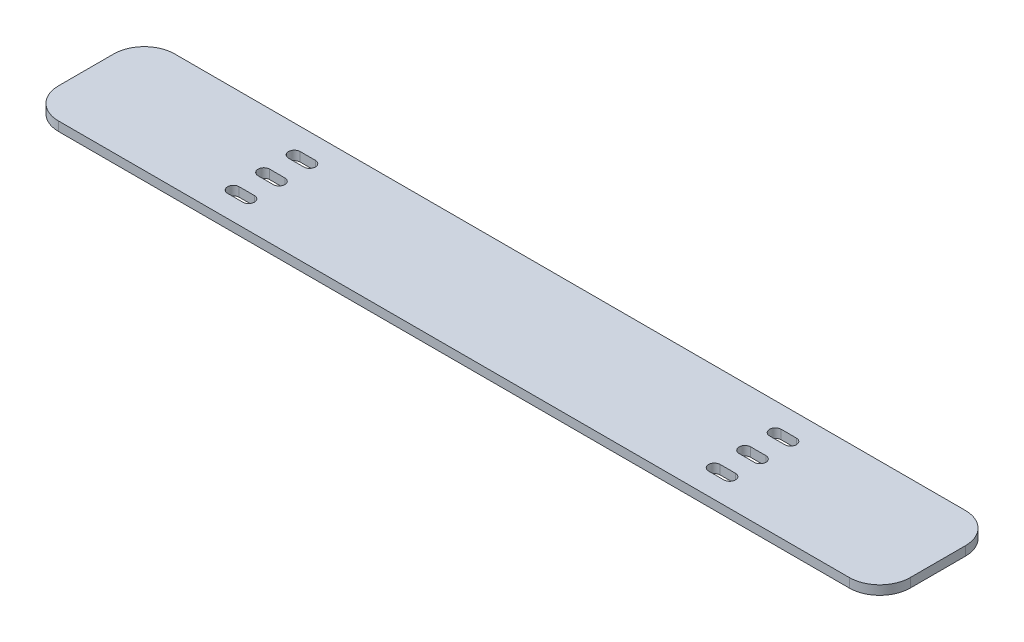
ISO-10303-21;
HEADER;
FILE_DESCRIPTION(('STEP AP214'),'2;1');
FILE_NAME('part.step','',(''),(''),'','','');
FILE_SCHEMA(('AUTOMOTIVE_DESIGN { 1 0 10303 214 1 1 1 1 }'));
ENDSEC;
DATA;
#1=APPLICATION_CONTEXT('core data for automotive mechanical design processes');
#2=APPLICATION_PROTOCOL_DEFINITION('international standard','automotive_design',2000,#1);
#3=PRODUCT_CONTEXT('',#1,'mechanical');
#4=PRODUCT('Part','Part','',(#3));
#5=PRODUCT_RELATED_PRODUCT_CATEGORY('part','',(#4));
#6=PRODUCT_DEFINITION_FORMATION('','',#4);
#7=PRODUCT_DEFINITION_CONTEXT('part definition',#1,'design');
#8=PRODUCT_DEFINITION('design','',#6,#7);
#9=PRODUCT_DEFINITION_SHAPE('','',#8);
#10=(LENGTH_UNIT() NAMED_UNIT(*) SI_UNIT(.MILLI.,.METRE.));
#11=(NAMED_UNIT(*) PLANE_ANGLE_UNIT() SI_UNIT($,.RADIAN.));
#12=(NAMED_UNIT(*) SI_UNIT($,.STERADIAN.) SOLID_ANGLE_UNIT());
#13=UNCERTAINTY_MEASURE_WITH_UNIT(LENGTH_MEASURE(1.E-05),#10,'distance_accuracy_value','');
#14=(GEOMETRIC_REPRESENTATION_CONTEXT(3) GLOBAL_UNCERTAINTY_ASSIGNED_CONTEXT((#13)) GLOBAL_UNIT_ASSIGNED_CONTEXT((#10,
#11,#12)) REPRESENTATION_CONTEXT('',''));
#15=CARTESIAN_POINT('',(0.,0.,0.));
#16=DIRECTION('',(0.,0.,1.));
#17=DIRECTION('',(1.,0.,0.));
#18=AXIS2_PLACEMENT_3D('',#15,#16,#17);
#19=CARTESIAN_POINT('',(10.,3.,28.1));
#20=DIRECTION('',(0.,-1.,0.));
#21=DIRECTION('',(0.,0.,-1.));
#22=AXIS2_PLACEMENT_3D('',#19,#20,#21);
#23=CYLINDRICAL_SURFACE('',#22,10.);
#24=CARTESIAN_POINT('',(10.,0.,28.1));
#25=DIRECTION('',(0.,1.,0.));
#26=DIRECTION('',(0.,0.,1.));
#27=AXIS2_PLACEMENT_3D('',#24,#25,#26);
#28=CIRCLE('',#27,10.);
#29=CARTESIAN_POINT('',(0.,0.,28.0999999999999));
#30=VERTEX_POINT('',#29);
#31=CARTESIAN_POINT('',(10.0000000000001,0.,38.1));
#32=VERTEX_POINT('',#31);
#33=EDGE_CURVE('E513',#30,#32,#28,.T.);
#34=ORIENTED_EDGE('',*,*,#33,.T.);
#35=DIRECTION('',(0.,-1.,0.));
#36=VECTOR('',#35,1.);
#37=CARTESIAN_POINT('',(10.0000000000001,3.,38.1));
#38=LINE('',#37,#36);
#39=CARTESIAN_POINT('',(10.0000000000001,3.,38.1));
#40=VERTEX_POINT('',#39);
#41=EDGE_CURVE('E11',#40,#32,#38,.T.);
#42=ORIENTED_EDGE('',*,*,#41,.F.);
#43=CARTESIAN_POINT('',(10.,3.,28.1));
#44=DIRECTION('',(0.,1.,0.));
#45=DIRECTION('',(0.,0.,1.));
#46=AXIS2_PLACEMENT_3D('',#43,#44,#45);
#47=CIRCLE('',#46,10.);
#48=CARTESIAN_POINT('',(0.,3.,28.0999999999999));
#49=VERTEX_POINT('',#48);
#50=EDGE_CURVE('E514',#49,#40,#47,.T.);
#51=ORIENTED_EDGE('',*,*,#50,.F.);
#52=DIRECTION('',(0.,-1.,0.));
#53=VECTOR('',#52,1.);
#54=CARTESIAN_POINT('',(0.,3.,28.0999999999999));
#55=LINE('',#54,#53);
#56=EDGE_CURVE('E540',#49,#30,#55,.T.);
#57=ORIENTED_EDGE('',*,*,#56,.T.);
#58=EDGE_LOOP('',(#34,#42,#51,#57));
#59=FACE_BOUND('',#58,.T.);
#60=ADVANCED_FACE('F39',(#59),#23,.T.);
#61=CARTESIAN_POINT('',(10.0000000000001,3.,38.1));
#62=DIRECTION('',(0.,0.,-1.));
#63=DIRECTION('',(-1.,0.,0.));
#64=AXIS2_PLACEMENT_3D('',#61,#62,#63);
#65=PLANE('',#64);
#66=DIRECTION('',(1.,0.,0.));
#67=VECTOR('',#66,1.);
#68=CARTESIAN_POINT('',(10.0000000000001,0.,38.1));
#69=LINE('',#68,#67);
#70=CARTESIAN_POINT('',(269.4,0.,38.1));
#71=VERTEX_POINT('',#70);
#72=EDGE_CURVE('E544',#32,#71,#69,.T.);
#73=ORIENTED_EDGE('',*,*,#72,.T.);
#74=DIRECTION('',(0.,-1.,0.));
#75=VECTOR('',#74,1.);
#76=CARTESIAN_POINT('',(269.4,3.,38.1));
#77=LINE('',#76,#75);
#78=CARTESIAN_POINT('',(269.4,3.,38.1));
#79=VERTEX_POINT('',#78);
#80=EDGE_CURVE('E47',#79,#71,#77,.T.);
#81=ORIENTED_EDGE('',*,*,#80,.F.);
#82=DIRECTION('',(1.,0.,0.));
#83=VECTOR('',#82,1.);
#84=CARTESIAN_POINT('',(10.0000000000001,3.,38.1));
#85=LINE('',#84,#83);
#86=EDGE_CURVE('E518',#40,#79,#85,.T.);
#87=ORIENTED_EDGE('',*,*,#86,.F.);
#88=ORIENTED_EDGE('',*,*,#41,.T.);
#89=EDGE_LOOP('',(#73,#81,#87,#88));
#90=FACE_BOUND('',#89,.T.);
#91=ADVANCED_FACE('F614',(#90),#65,.F.);
#92=CARTESIAN_POINT('',(269.4,3.,28.1));
#93=DIRECTION('',(0.,-1.,0.));
#94=DIRECTION('',(0.,0.,-1.));
#95=AXIS2_PLACEMENT_3D('',#92,#93,#94);
#96=CYLINDRICAL_SURFACE('',#95,10.);
#97=CARTESIAN_POINT('',(269.4,0.,28.1));
#98=DIRECTION('',(0.,1.,0.));
#99=DIRECTION('',(0.,0.,1.));
#100=AXIS2_PLACEMENT_3D('',#97,#98,#99);
#101=CIRCLE('',#100,10.);
#102=CARTESIAN_POINT('',(279.4,0.,28.0999999999999));
#103=VERTEX_POINT('',#102);
#104=EDGE_CURVE('E547',#71,#103,#101,.T.);
#105=ORIENTED_EDGE('',*,*,#104,.T.);
#106=DIRECTION('',(0.,-1.,0.));
#107=VECTOR('',#106,1.);
#108=CARTESIAN_POINT('',(279.4,3.,28.0999999999999));
#109=LINE('',#108,#107);
#110=CARTESIAN_POINT('',(279.4,3.,28.0999999999999));
#111=VERTEX_POINT('',#110);
#112=EDGE_CURVE('E583',#111,#103,#109,.T.);
#113=ORIENTED_EDGE('',*,*,#112,.F.);
#114=CARTESIAN_POINT('',(269.4,3.,28.1));
#115=DIRECTION('',(0.,1.,0.));
#116=DIRECTION('',(0.,0.,1.));
#117=AXIS2_PLACEMENT_3D('',#114,#115,#116);
#118=CIRCLE('',#117,10.);
#119=EDGE_CURVE('E522',#79,#111,#118,.T.);
#120=ORIENTED_EDGE('',*,*,#119,.F.);
#121=ORIENTED_EDGE('',*,*,#80,.T.);
#122=EDGE_LOOP('',(#105,#113,#120,#121));
#123=FACE_BOUND('',#122,.T.);
#124=ADVANCED_FACE('F592',(#123),#96,.T.);
#125=CARTESIAN_POINT('',(279.4,3.,10.0000000000001));
#126=DIRECTION('',(-1.,0.,0.));
#127=DIRECTION('',(0.,0.,1.));
#128=AXIS2_PLACEMENT_3D('',#125,#126,#127);
#129=PLANE('',#128);
#130=DIRECTION('',(0.,0.,-1.));
#131=VECTOR('',#130,1.);
#132=CARTESIAN_POINT('',(279.4,0.,10.0000000000001));
#133=LINE('',#132,#131);
#134=CARTESIAN_POINT('',(279.4,0.,10.0000000000001));
#135=VERTEX_POINT('',#134);
#136=EDGE_CURVE('E550',#103,#135,#133,.T.);
#137=ORIENTED_EDGE('',*,*,#136,.T.);
#138=DIRECTION('',(0.,-1.,0.));
#139=VECTOR('',#138,1.);
#140=CARTESIAN_POINT('',(279.4,3.,10.0000000000001));
#141=LINE('',#140,#139);
#142=CARTESIAN_POINT('',(279.4,3.,10.0000000000001));
#143=VERTEX_POINT('',#142);
#144=EDGE_CURVE('E579',#143,#135,#141,.T.);
#145=ORIENTED_EDGE('',*,*,#144,.F.);
#146=DIRECTION('',(0.,0.,-1.));
#147=VECTOR('',#146,1.);
#148=CARTESIAN_POINT('',(279.4,3.,10.0000000000001));
#149=LINE('',#148,#147);
#150=EDGE_CURVE('E525',#111,#143,#149,.T.);
#151=ORIENTED_EDGE('',*,*,#150,.F.);
#152=ORIENTED_EDGE('',*,*,#112,.T.);
#153=EDGE_LOOP('',(#137,#145,#151,#152));
#154=FACE_BOUND('',#153,.T.);
#155=ADVANCED_FACE('F602',(#154),#129,.F.);
#156=CARTESIAN_POINT('',(269.4,3.,10.));
#157=DIRECTION('',(0.,-1.,0.));
#158=DIRECTION('',(0.,0.,-1.));
#159=AXIS2_PLACEMENT_3D('',#156,#157,#158);
#160=CYLINDRICAL_SURFACE('',#159,10.);
#161=CARTESIAN_POINT('',(269.4,0.,10.));
#162=DIRECTION('',(0.,1.,0.));
#163=DIRECTION('',(0.,0.,-1.));
#164=AXIS2_PLACEMENT_3D('',#161,#162,#163);
#165=CIRCLE('',#164,10.);
#166=CARTESIAN_POINT('',(269.4,0.,0.));
#167=VERTEX_POINT('',#166);
#168=EDGE_CURVE('E553',#135,#167,#165,.T.);
#169=ORIENTED_EDGE('',*,*,#168,.T.);
#170=DIRECTION('',(0.,-1.,0.));
#171=VECTOR('',#170,1.);
#172=CARTESIAN_POINT('',(269.4,3.,0.));
#173=LINE('',#172,#171);
#174=CARTESIAN_POINT('',(269.4,3.,0.));
#175=VERTEX_POINT('',#174);
#176=EDGE_CURVE('E575',#175,#167,#173,.T.);
#177=ORIENTED_EDGE('',*,*,#176,.F.);
#178=CARTESIAN_POINT('',(269.4,3.,10.));
#179=DIRECTION('',(0.,1.,0.));
#180=DIRECTION('',(0.,0.,-1.));
#181=AXIS2_PLACEMENT_3D('',#178,#179,#180);
#182=CIRCLE('',#181,10.);
#183=EDGE_CURVE('E528',#143,#175,#182,.T.);
#184=ORIENTED_EDGE('',*,*,#183,.F.);
#185=ORIENTED_EDGE('',*,*,#144,.T.);
#186=EDGE_LOOP('',(#169,#177,#184,#185));
#187=FACE_BOUND('',#186,.T.);
#188=ADVANCED_FACE('F606',(#187),#160,.T.);
#189=CARTESIAN_POINT('',(10.0000000000001,3.,0.));
#190=DIRECTION('',(0.,0.,1.));
#191=DIRECTION('',(1.,0.,0.));
#192=AXIS2_PLACEMENT_3D('',#189,#190,#191);
#193=PLANE('',#192);
#194=DIRECTION('',(-1.,0.,0.));
#195=VECTOR('',#194,1.);
#196=CARTESIAN_POINT('',(10.0000000000001,0.,0.));
#197=LINE('',#196,#195);
#198=CARTESIAN_POINT('',(10.0000000000001,0.,0.));
#199=VERTEX_POINT('',#198);
#200=EDGE_CURVE('E556',#167,#199,#197,.T.);
#201=ORIENTED_EDGE('',*,*,#200,.T.);
#202=DIRECTION('',(0.,-1.,0.));
#203=VECTOR('',#202,1.);
#204=CARTESIAN_POINT('',(10.0000000000001,3.,0.));
#205=LINE('',#204,#203);
#206=CARTESIAN_POINT('',(10.0000000000001,3.,0.));
#207=VERTEX_POINT('',#206);
#208=EDGE_CURVE('E571',#207,#199,#205,.T.);
#209=ORIENTED_EDGE('',*,*,#208,.F.);
#210=DIRECTION('',(-1.,0.,0.));
#211=VECTOR('',#210,1.);
#212=CARTESIAN_POINT('',(10.0000000000001,3.,0.));
#213=LINE('',#212,#211);
#214=EDGE_CURVE('E531',#175,#207,#213,.T.);
#215=ORIENTED_EDGE('',*,*,#214,.F.);
#216=ORIENTED_EDGE('',*,*,#176,.T.);
#217=EDGE_LOOP('',(#201,#209,#215,#216));
#218=FACE_BOUND('',#217,.T.);
#219=ADVANCED_FACE('F627',(#218),#193,.F.);
#220=CARTESIAN_POINT('',(10.,3.,10.));
#221=DIRECTION('',(0.,-1.,0.));
#222=DIRECTION('',(0.,0.,-1.));
#223=AXIS2_PLACEMENT_3D('',#220,#221,#222);
#224=CYLINDRICAL_SURFACE('',#223,10.);
#225=CARTESIAN_POINT('',(10.,0.,10.));
#226=DIRECTION('',(0.,1.,0.));
#227=DIRECTION('',(0.,0.,1.));
#228=AXIS2_PLACEMENT_3D('',#225,#226,#227);
#229=CIRCLE('',#228,10.);
#230=CARTESIAN_POINT('',(0.,0.,10.0000000000001));
#231=VERTEX_POINT('',#230);
#232=EDGE_CURVE('E559',#199,#231,#229,.T.);
#233=ORIENTED_EDGE('',*,*,#232,.T.);
#234=DIRECTION('',(0.,-1.,0.));
#235=VECTOR('',#234,1.);
#236=CARTESIAN_POINT('',(0.,3.,10.0000000000001));
#237=LINE('',#236,#235);
#238=CARTESIAN_POINT('',(0.,3.,10.0000000000001));
#239=VERTEX_POINT('',#238);
#240=EDGE_CURVE('E567',#239,#231,#237,.T.);
#241=ORIENTED_EDGE('',*,*,#240,.F.);
#242=CARTESIAN_POINT('',(10.,3.,10.));
#243=DIRECTION('',(0.,1.,0.));
#244=DIRECTION('',(0.,0.,1.));
#245=AXIS2_PLACEMENT_3D('',#242,#243,#244);
#246=CIRCLE('',#245,10.);
#247=EDGE_CURVE('E534',#207,#239,#246,.T.);
#248=ORIENTED_EDGE('',*,*,#247,.F.);
#249=ORIENTED_EDGE('',*,*,#208,.T.);
#250=EDGE_LOOP('',(#233,#241,#248,#249));
#251=FACE_BOUND('',#250,.T.);
#252=ADVANCED_FACE('F625',(#251),#224,.T.);
#253=CARTESIAN_POINT('',(0.,3.,10.0000000000001));
#254=DIRECTION('',(1.,0.,0.));
#255=DIRECTION('',(0.,0.,-1.));
#256=AXIS2_PLACEMENT_3D('',#253,#254,#255);
#257=PLANE('',#256);
#258=DIRECTION('',(0.,0.,1.));
#259=VECTOR('',#258,1.);
#260=CARTESIAN_POINT('',(0.,0.,10.0000000000001));
#261=LINE('',#260,#259);
#262=EDGE_CURVE('E519',#231,#30,#261,.T.);
#263=ORIENTED_EDGE('',*,*,#262,.T.);
#264=ORIENTED_EDGE('',*,*,#56,.F.);
#265=DIRECTION('',(0.,0.,1.));
#266=VECTOR('',#265,1.);
#267=CARTESIAN_POINT('',(0.,3.,10.0000000000001));
#268=LINE('',#267,#266);
#269=EDGE_CURVE('E537',#239,#49,#268,.T.);
#270=ORIENTED_EDGE('',*,*,#269,.F.);
#271=ORIENTED_EDGE('',*,*,#240,.T.);
#272=EDGE_LOOP('',(#263,#264,#270,#271));
#273=FACE_BOUND('',#272,.T.);
#274=ADVANCED_FACE('F620',(#273),#257,.F.);
#275=CARTESIAN_POINT('',(10.,3.,28.1));
#276=DIRECTION('',(0.,1.,0.));
#277=DIRECTION('',(0.,0.,1.));
#278=AXIS2_PLACEMENT_3D('',#275,#276,#277);
#279=PLANE('',#278);
#280=CARTESIAN_POINT('',(58.2999999999999,3.,29.05));
#281=DIRECTION('',(0.,1.,0.));
#282=DIRECTION('',(0.,0.,1.));
#283=AXIS2_PLACEMENT_3D('',#280,#281,#282);
#284=CIRCLE('',#283,1.89999999999994);
#285=CARTESIAN_POINT('',(58.2999999999999,3.,27.1500000000001));
#286=VERTEX_POINT('',#285);
#287=CARTESIAN_POINT('',(58.2999999999999,3.,30.9499999999999));
#288=VERTEX_POINT('',#287);
#289=EDGE_CURVE('E54',#286,#288,#284,.T.);
#290=ORIENTED_EDGE('',*,*,#289,.F.);
#291=DIRECTION('',(-1.,0.,0.));
#292=VECTOR('',#291,1.);
#293=CARTESIAN_POINT('',(58.2999999999999,3.,27.1500000000001));
#294=LINE('',#293,#292);
#295=CARTESIAN_POINT('',(63.2999999999999,3.,27.1500000000001));
#296=VERTEX_POINT('',#295);
#297=EDGE_CURVE('E366',#296,#286,#294,.T.);
#298=ORIENTED_EDGE('',*,*,#297,.F.);
#299=CARTESIAN_POINT('',(63.2999999999999,3.,29.05));
#300=DIRECTION('',(0.,1.,0.));
#301=DIRECTION('',(0.,0.,1.));
#302=AXIS2_PLACEMENT_3D('',#299,#300,#301);
#303=CIRCLE('',#302,1.89999999999994);
#304=CARTESIAN_POINT('',(63.2999999999999,3.,30.9499999999999));
#305=VERTEX_POINT('',#304);
#306=EDGE_CURVE('E362',#305,#296,#303,.T.);
#307=ORIENTED_EDGE('',*,*,#306,.F.);
#308=DIRECTION('',(1.,0.,0.));
#309=VECTOR('',#308,1.);
#310=CARTESIAN_POINT('',(58.2999999999999,3.,30.9499999999999));
#311=LINE('',#310,#309);
#312=EDGE_CURVE('E358',#288,#305,#311,.T.);
#313=ORIENTED_EDGE('',*,*,#312,.F.);
#314=EDGE_LOOP('',(#290,#298,#307,#313));
#315=FACE_BOUND('',#314,.T.);
#316=CARTESIAN_POINT('',(221.1,3.,9.05));
#317=DIRECTION('',(0.,1.,0.));
#318=DIRECTION('',(0.,0.,-1.));
#319=AXIS2_PLACEMENT_3D('',#316,#317,#318);
#320=CIRCLE('',#319,1.89999999999994);
#321=CARTESIAN_POINT('',(221.1,3.,10.9499999999999));
#322=VERTEX_POINT('',#321);
#323=CARTESIAN_POINT('',(221.1,3.,7.15000000000005));
#324=VERTEX_POINT('',#323);
#325=EDGE_CURVE('E62',#322,#324,#320,.T.);
#326=ORIENTED_EDGE('',*,*,#325,.F.);
#327=DIRECTION('',(1.,0.,0.));
#328=VECTOR('',#327,1.);
#329=CARTESIAN_POINT('',(221.1,3.,10.9499999999999));
#330=LINE('',#329,#328);
#331=CARTESIAN_POINT('',(216.1,3.,10.9499999999999));
#332=VERTEX_POINT('',#331);
#333=EDGE_CURVE('E325',#332,#322,#330,.T.);
#334=ORIENTED_EDGE('',*,*,#333,.F.);
#335=CARTESIAN_POINT('',(216.1,3.,9.05));
#336=DIRECTION('',(0.,1.,0.));
#337=DIRECTION('',(0.,0.,-1.));
#338=AXIS2_PLACEMENT_3D('',#335,#336,#337);
#339=CIRCLE('',#338,1.89999999999994);
#340=CARTESIAN_POINT('',(216.1,3.,7.15000000000006));
#341=VERTEX_POINT('',#340);
#342=EDGE_CURVE('E321',#341,#332,#339,.T.);
#343=ORIENTED_EDGE('',*,*,#342,.F.);
#344=DIRECTION('',(-1.,0.,0.));
#345=VECTOR('',#344,1.);
#346=CARTESIAN_POINT('',(221.1,3.,7.15000000000005));
#347=LINE('',#346,#345);
#348=EDGE_CURVE('E317',#324,#341,#347,.T.);
#349=ORIENTED_EDGE('',*,*,#348,.F.);
#350=EDGE_LOOP('',(#326,#334,#343,#349));
#351=FACE_BOUND('',#350,.T.);
#352=CARTESIAN_POINT('',(221.1,3.,29.05));
#353=DIRECTION('',(0.,1.,0.));
#354=DIRECTION('',(0.,0.,-1.));
#355=AXIS2_PLACEMENT_3D('',#352,#353,#354);
#356=CIRCLE('',#355,1.89999999999994);
#357=CARTESIAN_POINT('',(221.1,3.,30.9499999999999));
#358=VERTEX_POINT('',#357);
#359=CARTESIAN_POINT('',(221.1,3.,27.1500000000001));
#360=VERTEX_POINT('',#359);
#361=EDGE_CURVE('E440',#358,#360,#356,.T.);
#362=ORIENTED_EDGE('',*,*,#361,.F.);
#363=DIRECTION('',(1.,0.,0.));
#364=VECTOR('',#363,1.);
#365=CARTESIAN_POINT('',(221.1,3.,30.9499999999999));
#366=LINE('',#365,#364);
#367=CARTESIAN_POINT('',(216.1,3.,30.9499999999999));
#368=VERTEX_POINT('',#367);
#369=EDGE_CURVE('E451',#368,#358,#366,.T.);
#370=ORIENTED_EDGE('',*,*,#369,.F.);
#371=CARTESIAN_POINT('',(216.1,3.,29.05));
#372=DIRECTION('',(0.,1.,0.));
#373=DIRECTION('',(0.,0.,-1.));
#374=AXIS2_PLACEMENT_3D('',#371,#372,#373);
#375=CIRCLE('',#374,1.89999999999994);
#376=CARTESIAN_POINT('',(216.1,3.,27.1500000000001));
#377=VERTEX_POINT('',#376);
#378=EDGE_CURVE('E447',#377,#368,#375,.T.);
#379=ORIENTED_EDGE('',*,*,#378,.F.);
#380=DIRECTION('',(-1.,0.,0.));
#381=VECTOR('',#380,1.);
#382=CARTESIAN_POINT('',(221.1,3.,27.1500000000001));
#383=LINE('',#382,#381);
#384=EDGE_CURVE('E443',#360,#377,#383,.T.);
#385=ORIENTED_EDGE('',*,*,#384,.F.);
#386=EDGE_LOOP('',(#362,#370,#379,#385));
#387=FACE_BOUND('',#386,.T.);
#388=CARTESIAN_POINT('',(221.1,3.,19.05));
#389=DIRECTION('',(0.,1.,0.));
#390=DIRECTION('',(0.,0.,-1.));
#391=AXIS2_PLACEMENT_3D('',#388,#389,#390);
#392=CIRCLE('',#391,1.89999999999994);
#393=CARTESIAN_POINT('',(221.1,3.,20.9499999999999));
#394=VERTEX_POINT('',#393);
#395=CARTESIAN_POINT('',(221.1,3.,17.1500000000001));
#396=VERTEX_POINT('',#395);
#397=EDGE_CURVE('E397',#394,#396,#392,.T.);
#398=ORIENTED_EDGE('',*,*,#397,.F.);
#399=DIRECTION('',(1.,0.,0.));
#400=VECTOR('',#399,1.);
#401=CARTESIAN_POINT('',(221.1,3.,20.9499999999999));
#402=LINE('',#401,#400);
#403=CARTESIAN_POINT('',(216.1,3.,20.9499999999999));
#404=VERTEX_POINT('',#403);
#405=EDGE_CURVE('E408',#404,#394,#402,.T.);
#406=ORIENTED_EDGE('',*,*,#405,.F.);
#407=CARTESIAN_POINT('',(216.1,3.,19.05));
#408=DIRECTION('',(0.,1.,0.));
#409=DIRECTION('',(0.,0.,-1.));
#410=AXIS2_PLACEMENT_3D('',#407,#408,#409);
#411=CIRCLE('',#410,1.89999999999994);
#412=CARTESIAN_POINT('',(216.1,3.,17.1500000000001));
#413=VERTEX_POINT('',#412);
#414=EDGE_CURVE('E404',#413,#404,#411,.T.);
#415=ORIENTED_EDGE('',*,*,#414,.F.);
#416=DIRECTION('',(-1.,0.,0.));
#417=VECTOR('',#416,1.);
#418=CARTESIAN_POINT('',(221.1,3.,17.1500000000001));
#419=LINE('',#418,#417);
#420=EDGE_CURVE('E400',#396,#413,#419,.T.);
#421=ORIENTED_EDGE('',*,*,#420,.F.);
#422=EDGE_LOOP('',(#398,#406,#415,#421));
#423=FACE_BOUND('',#422,.T.);
#424=CARTESIAN_POINT('',(58.3,3.,9.05));
#425=DIRECTION('',(0.,1.,0.));
#426=DIRECTION('',(0.,0.,1.));
#427=AXIS2_PLACEMENT_3D('',#424,#425,#426);
#428=CIRCLE('',#427,1.89999999999994);
#429=CARTESIAN_POINT('',(58.3,3.,7.15000000000005));
#430=VERTEX_POINT('',#429);
#431=CARTESIAN_POINT('',(58.3,3.,10.9499999999999));
#432=VERTEX_POINT('',#431);
#433=EDGE_CURVE('E255',#430,#432,#428,.T.);
#434=ORIENTED_EDGE('',*,*,#433,.F.);
#435=DIRECTION('',(-1.,0.,0.));
#436=VECTOR('',#435,1.);
#437=CARTESIAN_POINT('',(58.3,3.,7.15000000000005));
#438=LINE('',#437,#436);
#439=CARTESIAN_POINT('',(63.3,3.,7.15000000000006));
#440=VERTEX_POINT('',#439);
#441=EDGE_CURVE('E261',#440,#430,#438,.T.);
#442=ORIENTED_EDGE('',*,*,#441,.F.);
#443=CARTESIAN_POINT('',(63.3,3.,9.05));
#444=DIRECTION('',(0.,1.,0.));
#445=DIRECTION('',(0.,0.,1.));
#446=AXIS2_PLACEMENT_3D('',#443,#444,#445);
#447=CIRCLE('',#446,1.89999999999994);
#448=CARTESIAN_POINT('',(63.3,3.,10.9499999999999));
#449=VERTEX_POINT('',#448);
#450=EDGE_CURVE('E289',#449,#440,#447,.T.);
#451=ORIENTED_EDGE('',*,*,#450,.F.);
#452=DIRECTION('',(1.,0.,0.));
#453=VECTOR('',#452,1.);
#454=CARTESIAN_POINT('',(58.3,3.,10.9499999999999));
#455=LINE('',#454,#453);
#456=EDGE_CURVE('E281',#432,#449,#455,.T.);
#457=ORIENTED_EDGE('',*,*,#456,.F.);
#458=EDGE_LOOP('',(#434,#442,#451,#457));
#459=FACE_BOUND('',#458,.T.);
#460=CARTESIAN_POINT('',(58.3,3.,19.05));
#461=DIRECTION('',(0.,1.,0.));
#462=DIRECTION('',(0.,0.,1.));
#463=AXIS2_PLACEMENT_3D('',#460,#461,#462);
#464=CIRCLE('',#463,1.89999999999994);
#465=CARTESIAN_POINT('',(58.3,3.,17.1500000000001));
#466=VERTEX_POINT('',#465);
#467=CARTESIAN_POINT('',(58.3,3.,20.95));
#468=VERTEX_POINT('',#467);
#469=EDGE_CURVE('E481',#466,#468,#464,.T.);
#470=ORIENTED_EDGE('',*,*,#469,.F.);
#471=DIRECTION('',(-1.,0.,0.));
#472=VECTOR('',#471,1.);
#473=CARTESIAN_POINT('',(58.3,3.,17.1500000000001));
#474=LINE('',#473,#472);
#475=CARTESIAN_POINT('',(63.3,3.,17.1500000000001));
#476=VERTEX_POINT('',#475);
#477=EDGE_CURVE('E492',#476,#466,#474,.T.);
#478=ORIENTED_EDGE('',*,*,#477,.F.);
#479=CARTESIAN_POINT('',(63.3,3.,19.05));
#480=DIRECTION('',(0.,1.,0.));
#481=DIRECTION('',(0.,0.,1.));
#482=AXIS2_PLACEMENT_3D('',#479,#480,#481);
#483=CIRCLE('',#482,1.89999999999994);
#484=CARTESIAN_POINT('',(63.3,3.,20.9499999999999));
#485=VERTEX_POINT('',#484);
#486=EDGE_CURVE('E488',#485,#476,#483,.T.);
#487=ORIENTED_EDGE('',*,*,#486,.F.);
#488=DIRECTION('',(1.,0.,0.));
#489=VECTOR('',#488,1.);
#490=CARTESIAN_POINT('',(58.3,3.,20.95));
#491=LINE('',#490,#489);
#492=EDGE_CURVE('E484',#468,#485,#491,.T.);
#493=ORIENTED_EDGE('',*,*,#492,.F.);
#494=EDGE_LOOP('',(#470,#478,#487,#493));
#495=FACE_BOUND('',#494,.T.);
#496=ORIENTED_EDGE('',*,*,#50,.T.);
#497=ORIENTED_EDGE('',*,*,#86,.T.);
#498=ORIENTED_EDGE('',*,*,#119,.T.);
#499=ORIENTED_EDGE('',*,*,#150,.T.);
#500=ORIENTED_EDGE('',*,*,#183,.T.);
#501=ORIENTED_EDGE('',*,*,#214,.T.);
#502=ORIENTED_EDGE('',*,*,#247,.T.);
#503=ORIENTED_EDGE('',*,*,#269,.T.);
#504=EDGE_LOOP('',(#496,#497,#498,#499,#500,#501,#502,#503));
#505=FACE_BOUND('',#504,.T.);
#506=ADVANCED_FACE('F610',(#315,#351,#387,#423,#459,#495,#505),#279,.T.);
#507=CARTESIAN_POINT('',(10.,0.,28.1));
#508=DIRECTION('',(0.,1.,0.));
#509=DIRECTION('',(0.,0.,1.));
#510=AXIS2_PLACEMENT_3D('',#507,#508,#509);
#511=PLANE('',#510);
#512=DIRECTION('',(1.,0.,0.));
#513=VECTOR('',#512,1.);
#514=CARTESIAN_POINT('',(58.2999999999999,0.,27.1500000000001));
#515=LINE('',#514,#513);
#516=CARTESIAN_POINT('',(58.2999999999999,0.,27.1500000000001));
#517=VERTEX_POINT('',#516);
#518=CARTESIAN_POINT('',(63.2999999999999,0.,27.1500000000001));
#519=VERTEX_POINT('',#518);
#520=EDGE_CURVE('E348',#517,#519,#515,.T.);
#521=ORIENTED_EDGE('',*,*,#520,.F.);
#522=CARTESIAN_POINT('',(58.2999999999999,0.,29.05));
#523=DIRECTION('',(0.,1.,0.));
#524=DIRECTION('',(0.,0.,1.));
#525=AXIS2_PLACEMENT_3D('',#522,#523,#524);
#526=CIRCLE('',#525,1.89999999999994);
#527=CARTESIAN_POINT('',(58.2999999999999,0.,30.9499999999999));
#528=VERTEX_POINT('',#527);
#529=EDGE_CURVE('E352',#528,#517,#526,.F.);
#530=ORIENTED_EDGE('',*,*,#529,.F.);
#531=DIRECTION('',(-1.,0.,0.));
#532=VECTOR('',#531,1.);
#533=CARTESIAN_POINT('',(58.2999999999999,0.,30.9499999999999));
#534=LINE('',#533,#532);
#535=CARTESIAN_POINT('',(63.2999999999999,0.,30.9499999999999));
#536=VERTEX_POINT('',#535);
#537=EDGE_CURVE('E307',#536,#528,#534,.T.);
#538=ORIENTED_EDGE('',*,*,#537,.F.);
#539=CARTESIAN_POINT('',(63.2999999999999,0.,29.05));
#540=DIRECTION('',(0.,1.,0.));
#541=DIRECTION('',(0.,0.,1.));
#542=AXIS2_PLACEMENT_3D('',#539,#540,#541);
#543=CIRCLE('',#542,1.89999999999994);
#544=EDGE_CURVE('E270',#519,#536,#543,.F.);
#545=ORIENTED_EDGE('',*,*,#544,.F.);
#546=EDGE_LOOP('',(#521,#530,#538,#545));
#547=FACE_BOUND('',#546,.T.);
#548=DIRECTION('',(-1.,0.,0.));
#549=VECTOR('',#548,1.);
#550=CARTESIAN_POINT('',(221.1,0.,10.9499999999999));
#551=LINE('',#550,#549);
#552=CARTESIAN_POINT('',(221.1,0.,10.9499999999999));
#553=VERTEX_POINT('',#552);
#554=CARTESIAN_POINT('',(216.1,0.,10.9499999999999));
#555=VERTEX_POINT('',#554);
#556=EDGE_CURVE('E306',#553,#555,#551,.T.);
#557=ORIENTED_EDGE('',*,*,#556,.F.);
#558=CARTESIAN_POINT('',(221.1,0.,9.05));
#559=DIRECTION('',(0.,1.,0.));
#560=DIRECTION('',(0.,0.,1.));
#561=AXIS2_PLACEMENT_3D('',#558,#559,#560);
#562=CIRCLE('',#561,1.89999999999994);
#563=CARTESIAN_POINT('',(221.1,0.,7.15000000000005));
#564=VERTEX_POINT('',#563);
#565=EDGE_CURVE('E311',#564,#553,#562,.F.);
#566=ORIENTED_EDGE('',*,*,#565,.F.);
#567=DIRECTION('',(1.,0.,0.));
#568=VECTOR('',#567,1.);
#569=CARTESIAN_POINT('',(221.1,0.,7.15000000000005));
#570=LINE('',#569,#568);
#571=CARTESIAN_POINT('',(216.1,0.,7.15000000000005));
#572=VERTEX_POINT('',#571);
#573=EDGE_CURVE('E333',#572,#564,#570,.T.);
#574=ORIENTED_EDGE('',*,*,#573,.F.);
#575=CARTESIAN_POINT('',(216.1,0.,9.05));
#576=DIRECTION('',(0.,1.,0.));
#577=DIRECTION('',(0.,0.,1.));
#578=AXIS2_PLACEMENT_3D('',#575,#576,#577);
#579=CIRCLE('',#578,1.89999999999994);
#580=EDGE_CURVE('E303',#555,#572,#579,.F.);
#581=ORIENTED_EDGE('',*,*,#580,.F.);
#582=EDGE_LOOP('',(#557,#566,#574,#581));
#583=FACE_BOUND('',#582,.T.);
#584=DIRECTION('',(-1.,0.,0.));
#585=VECTOR('',#584,1.);
#586=CARTESIAN_POINT('',(221.1,0.,30.9499999999999));
#587=LINE('',#586,#585);
#588=CARTESIAN_POINT('',(221.1,0.,30.9499999999999));
#589=VERTEX_POINT('',#588);
#590=CARTESIAN_POINT('',(216.1,0.,30.9499999999999));
#591=VERTEX_POINT('',#590);
#592=EDGE_CURVE('E432',#589,#591,#587,.T.);
#593=ORIENTED_EDGE('',*,*,#592,.F.);
#594=CARTESIAN_POINT('',(221.1,0.,29.05));
#595=DIRECTION('',(0.,1.,0.));
#596=DIRECTION('',(0.,0.,1.));
#597=AXIS2_PLACEMENT_3D('',#594,#595,#596);
#598=CIRCLE('',#597,1.89999999999994);
#599=CARTESIAN_POINT('',(221.1,0.,27.1500000000001));
#600=VERTEX_POINT('',#599);
#601=EDGE_CURVE('E436',#600,#589,#598,.F.);
#602=ORIENTED_EDGE('',*,*,#601,.F.);
#603=DIRECTION('',(1.,0.,0.));
#604=VECTOR('',#603,1.);
#605=CARTESIAN_POINT('',(221.1,0.,27.1500000000001));
#606=LINE('',#605,#604);
#607=CARTESIAN_POINT('',(216.1,0.,27.1500000000001));
#608=VERTEX_POINT('',#607);
#609=EDGE_CURVE('E389',#608,#600,#606,.T.);
#610=ORIENTED_EDGE('',*,*,#609,.F.);
#611=CARTESIAN_POINT('',(216.1,0.,29.05));
#612=DIRECTION('',(0.,1.,0.));
#613=DIRECTION('',(0.,0.,1.));
#614=AXIS2_PLACEMENT_3D('',#611,#612,#613);
#615=CIRCLE('',#614,1.89999999999994);
#616=EDGE_CURVE('E345',#591,#608,#615,.F.);
#617=ORIENTED_EDGE('',*,*,#616,.F.);
#618=EDGE_LOOP('',(#593,#602,#610,#617));
#619=FACE_BOUND('',#618,.T.);
#620=DIRECTION('',(-1.,0.,0.));
#621=VECTOR('',#620,1.);
#622=CARTESIAN_POINT('',(221.1,0.,20.9499999999999));
#623=LINE('',#622,#621);
#624=CARTESIAN_POINT('',(221.1,0.,20.9499999999999));
#625=VERTEX_POINT('',#624);
#626=CARTESIAN_POINT('',(216.1,0.,20.9499999999999));
#627=VERTEX_POINT('',#626);
#628=EDGE_CURVE('E388',#625,#627,#623,.T.);
#629=ORIENTED_EDGE('',*,*,#628,.F.);
#630=CARTESIAN_POINT('',(221.1,0.,19.05));
#631=DIRECTION('',(0.,1.,0.));
#632=DIRECTION('',(0.,0.,1.));
#633=AXIS2_PLACEMENT_3D('',#630,#631,#632);
#634=CIRCLE('',#633,1.89999999999994);
#635=CARTESIAN_POINT('',(221.1,0.,17.1500000000001));
#636=VERTEX_POINT('',#635);
#637=EDGE_CURVE('E393',#636,#625,#634,.F.);
#638=ORIENTED_EDGE('',*,*,#637,.F.);
#639=DIRECTION('',(1.,0.,0.));
#640=VECTOR('',#639,1.);
#641=CARTESIAN_POINT('',(221.1,0.,17.1500000000001));
#642=LINE('',#641,#640);
#643=CARTESIAN_POINT('',(216.1,0.,17.1500000000001));
#644=VERTEX_POINT('',#643);
#645=EDGE_CURVE('E416',#644,#636,#642,.T.);
#646=ORIENTED_EDGE('',*,*,#645,.F.);
#647=CARTESIAN_POINT('',(216.1,0.,19.05));
#648=DIRECTION('',(0.,1.,0.));
#649=DIRECTION('',(0.,0.,1.));
#650=AXIS2_PLACEMENT_3D('',#647,#648,#649);
#651=CIRCLE('',#650,1.89999999999994);
#652=EDGE_CURVE('E385',#627,#644,#651,.F.);
#653=ORIENTED_EDGE('',*,*,#652,.F.);
#654=EDGE_LOOP('',(#629,#638,#646,#653));
#655=FACE_BOUND('',#654,.T.);
#656=DIRECTION('',(1.,0.,0.));
#657=VECTOR('',#656,1.);
#658=CARTESIAN_POINT('',(58.3,0.,7.15000000000005));
#659=LINE('',#658,#657);
#660=CARTESIAN_POINT('',(58.3,0.,7.15000000000005));
#661=VERTEX_POINT('',#660);
#662=CARTESIAN_POINT('',(63.3,0.,7.15000000000006));
#663=VERTEX_POINT('',#662);
#664=EDGE_CURVE('E276',#661,#663,#659,.T.);
#665=ORIENTED_EDGE('',*,*,#664,.F.);
#666=CARTESIAN_POINT('',(58.3,0.,9.05));
#667=DIRECTION('',(0.,1.,0.));
#668=DIRECTION('',(0.,0.,1.));
#669=AXIS2_PLACEMENT_3D('',#666,#667,#668);
#670=CIRCLE('',#669,1.89999999999994);
#671=CARTESIAN_POINT('',(58.3,0.,10.9499999999999));
#672=VERTEX_POINT('',#671);
#673=EDGE_CURVE('E252',#672,#661,#670,.F.);
#674=ORIENTED_EDGE('',*,*,#673,.F.);
#675=DIRECTION('',(-1.,0.,0.));
#676=VECTOR('',#675,1.);
#677=CARTESIAN_POINT('',(58.3,0.,10.9499999999999));
#678=LINE('',#677,#676);
#679=CARTESIAN_POINT('',(63.3,0.,10.9499999999999));
#680=VERTEX_POINT('',#679);
#681=EDGE_CURVE('E265',#680,#672,#678,.T.);
#682=ORIENTED_EDGE('',*,*,#681,.F.);
#683=CARTESIAN_POINT('',(63.3,0.,9.05));
#684=DIRECTION('',(0.,1.,0.));
#685=DIRECTION('',(0.,0.,1.));
#686=AXIS2_PLACEMENT_3D('',#683,#684,#685);
#687=CIRCLE('',#686,1.89999999999994);
#688=EDGE_CURVE('E283',#663,#680,#687,.F.);
#689=ORIENTED_EDGE('',*,*,#688,.F.);
#690=EDGE_LOOP('',(#665,#674,#682,#689));
#691=FACE_BOUND('',#690,.T.);
#692=DIRECTION('',(1.,0.,0.));
#693=VECTOR('',#692,1.);
#694=CARTESIAN_POINT('',(58.3,0.,17.1500000000001));
#695=LINE('',#694,#693);
#696=CARTESIAN_POINT('',(58.3,0.,17.1500000000001));
#697=VERTEX_POINT('',#696);
#698=CARTESIAN_POINT('',(63.3,0.,17.1500000000001));
#699=VERTEX_POINT('',#698);
#700=EDGE_CURVE('E473',#697,#699,#695,.T.);
#701=ORIENTED_EDGE('',*,*,#700,.F.);
#702=CARTESIAN_POINT('',(58.3,0.,19.05));
#703=DIRECTION('',(0.,1.,0.));
#704=DIRECTION('',(0.,0.,1.));
#705=AXIS2_PLACEMENT_3D('',#702,#703,#704);
#706=CIRCLE('',#705,1.89999999999994);
#707=CARTESIAN_POINT('',(58.3,0.,20.95));
#708=VERTEX_POINT('',#707);
#709=EDGE_CURVE('E477',#708,#697,#706,.F.);
#710=ORIENTED_EDGE('',*,*,#709,.F.);
#711=DIRECTION('',(-1.,0.,0.));
#712=VECTOR('',#711,1.);
#713=CARTESIAN_POINT('',(58.3,0.,20.95));
#714=LINE('',#713,#712);
#715=CARTESIAN_POINT('',(63.3,0.,20.95));
#716=VERTEX_POINT('',#715);
#717=EDGE_CURVE('E500',#716,#708,#714,.T.);
#718=ORIENTED_EDGE('',*,*,#717,.F.);
#719=CARTESIAN_POINT('',(63.3,0.,19.05));
#720=DIRECTION('',(0.,1.,0.));
#721=DIRECTION('',(0.,0.,1.));
#722=AXIS2_PLACEMENT_3D('',#719,#720,#721);
#723=CIRCLE('',#722,1.89999999999994);
#724=EDGE_CURVE('E429',#699,#716,#723,.F.);
#725=ORIENTED_EDGE('',*,*,#724,.F.);
#726=EDGE_LOOP('',(#701,#710,#718,#725));
#727=FACE_BOUND('',#726,.T.);
#728=ORIENTED_EDGE('',*,*,#33,.F.);
#729=ORIENTED_EDGE('',*,*,#262,.F.);
#730=ORIENTED_EDGE('',*,*,#232,.F.);
#731=ORIENTED_EDGE('',*,*,#200,.F.);
#732=ORIENTED_EDGE('',*,*,#168,.F.);
#733=ORIENTED_EDGE('',*,*,#136,.F.);
#734=ORIENTED_EDGE('',*,*,#104,.F.);
#735=ORIENTED_EDGE('',*,*,#72,.F.);
#736=EDGE_LOOP('',(#728,#729,#730,#731,#732,#733,#734,#735));
#737=FACE_BOUND('',#736,.T.);
#738=ADVANCED_FACE('F273',(#547,#583,#619,#655,#691,#727,#737),#511,.F.);
#739=CARTESIAN_POINT('',(58.3,-0.00100000000000013,19.05));
#740=DIRECTION('',(0.,1.,0.));
#741=DIRECTION('',(0.,0.,1.));
#742=AXIS2_PLACEMENT_3D('',#739,#740,#741);
#743=CYLINDRICAL_SURFACE('',#742,1.89999999999994);
#744=ORIENTED_EDGE('',*,*,#709,.T.);
#745=DIRECTION('',(0.,1.,0.));
#746=VECTOR('',#745,1.);
#747=CARTESIAN_POINT('',(58.3,-0.00100000000000013,17.1500000000001));
#748=LINE('',#747,#746);
#749=EDGE_CURVE('E497',#697,#466,#748,.T.);
#750=ORIENTED_EDGE('',*,*,#749,.T.);
#751=ORIENTED_EDGE('',*,*,#469,.T.);
#752=DIRECTION('',(0.,1.,0.));
#753=VECTOR('',#752,1.);
#754=CARTESIAN_POINT('',(58.3,-0.00100000000000013,20.95));
#755=LINE('',#754,#753);
#756=EDGE_CURVE('E496',#708,#468,#755,.T.);
#757=ORIENTED_EDGE('',*,*,#756,.F.);
#758=EDGE_LOOP('',(#744,#750,#751,#757));
#759=FACE_BOUND('',#758,.T.);
#760=ADVANCED_FACE('F690',(#759),#743,.F.);
#761=CARTESIAN_POINT('',(58.3,-0.00100000000000013,17.1500000000001));
#762=DIRECTION('',(0.,0.,-1.));
#763=DIRECTION('',(-1.,0.,0.));
#764=AXIS2_PLACEMENT_3D('',#761,#762,#763);
#765=PLANE('',#764);
#766=ORIENTED_EDGE('',*,*,#700,.T.);
#767=DIRECTION('',(0.,1.,0.));
#768=VECTOR('',#767,1.);
#769=CARTESIAN_POINT('',(63.3,-0.00100000000000013,17.1500000000001));
#770=LINE('',#769,#768);
#771=EDGE_CURVE('E501',#699,#476,#770,.T.);
#772=ORIENTED_EDGE('',*,*,#771,.T.);
#773=ORIENTED_EDGE('',*,*,#477,.T.);
#774=ORIENTED_EDGE('',*,*,#749,.F.);
#775=EDGE_LOOP('',(#766,#772,#773,#774));
#776=FACE_BOUND('',#775,.T.);
#777=ADVANCED_FACE('F700',(#776),#765,.F.);
#778=CARTESIAN_POINT('',(63.3,-0.00100000000000013,19.05));
#779=DIRECTION('',(0.,1.,0.));
#780=DIRECTION('',(0.,0.,1.));
#781=AXIS2_PLACEMENT_3D('',#778,#779,#780);
#782=CYLINDRICAL_SURFACE('',#781,1.89999999999994);
#783=ORIENTED_EDGE('',*,*,#724,.T.);
#784=DIRECTION('',(0.,1.,0.));
#785=VECTOR('',#784,1.);
#786=CARTESIAN_POINT('',(63.3,-0.00100000000000013,20.9499999999999));
#787=LINE('',#786,#785);
#788=EDGE_CURVE('E504',#716,#485,#787,.T.);
#789=ORIENTED_EDGE('',*,*,#788,.T.);
#790=ORIENTED_EDGE('',*,*,#486,.T.);
#791=ORIENTED_EDGE('',*,*,#771,.F.);
#792=EDGE_LOOP('',(#783,#789,#790,#791));
#793=FACE_BOUND('',#792,.T.);
#794=ADVANCED_FACE('F710',(#793),#782,.F.);
#795=CARTESIAN_POINT('',(58.3,-0.00100000000000013,20.95));
#796=DIRECTION('',(0.,0.,1.));
#797=DIRECTION('',(1.,0.,0.));
#798=AXIS2_PLACEMENT_3D('',#795,#796,#797);
#799=PLANE('',#798);
#800=ORIENTED_EDGE('',*,*,#717,.T.);
#801=ORIENTED_EDGE('',*,*,#756,.T.);
#802=ORIENTED_EDGE('',*,*,#492,.T.);
#803=ORIENTED_EDGE('',*,*,#788,.F.);
#804=EDGE_LOOP('',(#800,#801,#802,#803));
#805=FACE_BOUND('',#804,.T.);
#806=ADVANCED_FACE('F720',(#805),#799,.F.);
#807=CARTESIAN_POINT('',(58.3,-0.00100000000000013,9.05));
#808=DIRECTION('',(0.,1.,0.));
#809=DIRECTION('',(0.,0.,1.));
#810=AXIS2_PLACEMENT_3D('',#807,#808,#809);
#811=CYLINDRICAL_SURFACE('',#810,1.89999999999994);
#812=ORIENTED_EDGE('',*,*,#673,.T.);
#813=DIRECTION('',(0.,1.,0.));
#814=VECTOR('',#813,1.);
#815=CARTESIAN_POINT('',(58.3,-0.00100000000000013,7.15000000000005));
#816=LINE('',#815,#814);
#817=EDGE_CURVE('E271',#661,#430,#816,.T.);
#818=ORIENTED_EDGE('',*,*,#817,.T.);
#819=ORIENTED_EDGE('',*,*,#433,.T.);
#820=DIRECTION('',(0.,1.,0.));
#821=VECTOR('',#820,1.);
#822=CARTESIAN_POINT('',(58.3,-0.00100000000000013,10.9499999999999));
#823=LINE('',#822,#821);
#824=EDGE_CURVE('E248',#672,#432,#823,.T.);
#825=ORIENTED_EDGE('',*,*,#824,.F.);
#826=EDGE_LOOP('',(#812,#818,#819,#825));
#827=FACE_BOUND('',#826,.T.);
#828=ADVANCED_FACE('F250',(#827),#811,.F.);
#829=CARTESIAN_POINT('',(58.3,-0.00100000000000013,7.15000000000005));
#830=DIRECTION('',(0.,0.,-1.));
#831=DIRECTION('',(-1.,0.,0.));
#832=AXIS2_PLACEMENT_3D('',#829,#830,#831);
#833=PLANE('',#832);
#834=ORIENTED_EDGE('',*,*,#664,.T.);
#835=DIRECTION('',(0.,1.,0.));
#836=VECTOR('',#835,1.);
#837=CARTESIAN_POINT('',(63.3,-0.00100000000000013,7.15000000000006));
#838=LINE('',#837,#836);
#839=EDGE_CURVE('E298',#663,#440,#838,.T.);
#840=ORIENTED_EDGE('',*,*,#839,.T.);
#841=ORIENTED_EDGE('',*,*,#441,.T.);
#842=ORIENTED_EDGE('',*,*,#817,.F.);
#843=EDGE_LOOP('',(#834,#840,#841,#842));
#844=FACE_BOUND('',#843,.T.);
#845=ADVANCED_FACE('F739',(#844),#833,.F.);
#846=CARTESIAN_POINT('',(63.3,-0.00100000000000013,9.05));
#847=DIRECTION('',(0.,1.,0.));
#848=DIRECTION('',(0.,0.,1.));
#849=AXIS2_PLACEMENT_3D('',#846,#847,#848);
#850=CYLINDRICAL_SURFACE('',#849,1.89999999999994);
#851=ORIENTED_EDGE('',*,*,#688,.T.);
#852=DIRECTION('',(0.,1.,0.));
#853=VECTOR('',#852,1.);
#854=CARTESIAN_POINT('',(63.3,-0.00100000000000013,10.9499999999999));
#855=LINE('',#854,#853);
#856=EDGE_CURVE('E260',#680,#449,#855,.T.);
#857=ORIENTED_EDGE('',*,*,#856,.T.);
#858=ORIENTED_EDGE('',*,*,#450,.T.);
#859=ORIENTED_EDGE('',*,*,#839,.F.);
#860=EDGE_LOOP('',(#851,#857,#858,#859));
#861=FACE_BOUND('',#860,.T.);
#862=ADVANCED_FACE('F748',(#861),#850,.F.);
#863=CARTESIAN_POINT('',(58.3,-0.00100000000000013,10.9499999999999));
#864=DIRECTION('',(0.,0.,1.));
#865=DIRECTION('',(1.,0.,0.));
#866=AXIS2_PLACEMENT_3D('',#863,#864,#865);
#867=PLANE('',#866);
#868=ORIENTED_EDGE('',*,*,#681,.T.);
#869=ORIENTED_EDGE('',*,*,#824,.T.);
#870=ORIENTED_EDGE('',*,*,#456,.T.);
#871=ORIENTED_EDGE('',*,*,#856,.F.);
#872=EDGE_LOOP('',(#868,#869,#870,#871));
#873=FACE_BOUND('',#872,.T.);
#874=ADVANCED_FACE('F266',(#873),#867,.F.);
#875=CARTESIAN_POINT('',(221.1,-0.00100000000000013,19.05));
#876=DIRECTION('',(0.,1.,0.));
#877=DIRECTION('',(0.,0.,1.));
#878=AXIS2_PLACEMENT_3D('',#875,#876,#877);
#879=CYLINDRICAL_SURFACE('',#878,1.89999999999994);
#880=ORIENTED_EDGE('',*,*,#637,.T.);
#881=DIRECTION('',(0.,1.,0.));
#882=VECTOR('',#881,1.);
#883=CARTESIAN_POINT('',(221.1,-0.00100000000000013,20.9499999999999));
#884=LINE('',#883,#882);
#885=EDGE_CURVE('E413',#625,#394,#884,.T.);
#886=ORIENTED_EDGE('',*,*,#885,.T.);
#887=ORIENTED_EDGE('',*,*,#397,.T.);
#888=DIRECTION('',(0.,1.,0.));
#889=VECTOR('',#888,1.);
#890=CARTESIAN_POINT('',(221.1,-0.00100000000000013,17.1500000000001));
#891=LINE('',#890,#889);
#892=EDGE_CURVE('E412',#636,#396,#891,.T.);
#893=ORIENTED_EDGE('',*,*,#892,.F.);
#894=EDGE_LOOP('',(#880,#886,#887,#893));
#895=FACE_BOUND('',#894,.T.);
#896=ADVANCED_FACE('F767',(#895),#879,.F.);
#897=CARTESIAN_POINT('',(221.1,-0.00100000000000013,20.9499999999999));
#898=DIRECTION('',(0.,0.,1.));
#899=DIRECTION('',(1.,0.,0.));
#900=AXIS2_PLACEMENT_3D('',#897,#898,#899);
#901=PLANE('',#900);
#902=ORIENTED_EDGE('',*,*,#628,.T.);
#903=DIRECTION('',(0.,1.,0.));
#904=VECTOR('',#903,1.);
#905=CARTESIAN_POINT('',(216.1,-0.00100000000000013,20.9499999999999));
#906=LINE('',#905,#904);
#907=EDGE_CURVE('E417',#627,#404,#906,.T.);
#908=ORIENTED_EDGE('',*,*,#907,.T.);
#909=ORIENTED_EDGE('',*,*,#405,.T.);
#910=ORIENTED_EDGE('',*,*,#885,.F.);
#911=EDGE_LOOP('',(#902,#908,#909,#910));
#912=FACE_BOUND('',#911,.T.);
#913=ADVANCED_FACE('F776',(#912),#901,.F.);
#914=CARTESIAN_POINT('',(216.1,-0.00100000000000013,19.05));
#915=DIRECTION('',(0.,1.,0.));
#916=DIRECTION('',(0.,0.,1.));
#917=AXIS2_PLACEMENT_3D('',#914,#915,#916);
#918=CYLINDRICAL_SURFACE('',#917,1.89999999999994);
#919=ORIENTED_EDGE('',*,*,#652,.T.);
#920=DIRECTION('',(0.,1.,0.));
#921=VECTOR('',#920,1.);
#922=CARTESIAN_POINT('',(216.1,-0.00100000000000013,17.1500000000001));
#923=LINE('',#922,#921);
#924=EDGE_CURVE('E420',#644,#413,#923,.T.);
#925=ORIENTED_EDGE('',*,*,#924,.T.);
#926=ORIENTED_EDGE('',*,*,#414,.T.);
#927=ORIENTED_EDGE('',*,*,#907,.F.);
#928=EDGE_LOOP('',(#919,#925,#926,#927));
#929=FACE_BOUND('',#928,.T.);
#930=ADVANCED_FACE('F786',(#929),#918,.F.);
#931=CARTESIAN_POINT('',(221.1,-0.00100000000000013,17.1500000000001));
#932=DIRECTION('',(0.,0.,-1.));
#933=DIRECTION('',(-1.,0.,0.));
#934=AXIS2_PLACEMENT_3D('',#931,#932,#933);
#935=PLANE('',#934);
#936=ORIENTED_EDGE('',*,*,#645,.T.);
#937=ORIENTED_EDGE('',*,*,#892,.T.);
#938=ORIENTED_EDGE('',*,*,#420,.T.);
#939=ORIENTED_EDGE('',*,*,#924,.F.);
#940=EDGE_LOOP('',(#936,#937,#938,#939));
#941=FACE_BOUND('',#940,.T.);
#942=ADVANCED_FACE('F796',(#941),#935,.F.);
#943=CARTESIAN_POINT('',(221.1,-0.00100000000000013,29.05));
#944=DIRECTION('',(0.,1.,0.));
#945=DIRECTION('',(0.,0.,1.));
#946=AXIS2_PLACEMENT_3D('',#943,#944,#945);
#947=CYLINDRICAL_SURFACE('',#946,1.89999999999994);
#948=ORIENTED_EDGE('',*,*,#601,.T.);
#949=DIRECTION('',(0.,1.,0.));
#950=VECTOR('',#949,1.);
#951=CARTESIAN_POINT('',(221.1,-0.00100000000000013,30.9499999999999));
#952=LINE('',#951,#950);
#953=EDGE_CURVE('E456',#589,#358,#952,.T.);
#954=ORIENTED_EDGE('',*,*,#953,.T.);
#955=ORIENTED_EDGE('',*,*,#361,.T.);
#956=DIRECTION('',(0.,1.,0.));
#957=VECTOR('',#956,1.);
#958=CARTESIAN_POINT('',(221.1,-0.00100000000000013,27.1500000000001));
#959=LINE('',#958,#957);
#960=EDGE_CURVE('E455',#600,#360,#959,.T.);
#961=ORIENTED_EDGE('',*,*,#960,.F.);
#962=EDGE_LOOP('',(#948,#954,#955,#961));
#963=FACE_BOUND('',#962,.T.);
#964=ADVANCED_FACE('F806',(#963),#947,.F.);
#965=CARTESIAN_POINT('',(221.1,-0.00100000000000013,30.9499999999999));
#966=DIRECTION('',(0.,0.,1.));
#967=DIRECTION('',(1.,0.,0.));
#968=AXIS2_PLACEMENT_3D('',#965,#966,#967);
#969=PLANE('',#968);
#970=ORIENTED_EDGE('',*,*,#592,.T.);
#971=DIRECTION('',(0.,1.,0.));
#972=VECTOR('',#971,1.);
#973=CARTESIAN_POINT('',(216.1,-0.00100000000000013,30.9499999999999));
#974=LINE('',#973,#972);
#975=EDGE_CURVE('E459',#591,#368,#974,.T.);
#976=ORIENTED_EDGE('',*,*,#975,.T.);
#977=ORIENTED_EDGE('',*,*,#369,.T.);
#978=ORIENTED_EDGE('',*,*,#953,.F.);
#979=EDGE_LOOP('',(#970,#976,#977,#978));
#980=FACE_BOUND('',#979,.T.);
#981=ADVANCED_FACE('F816',(#980),#969,.F.);
#982=CARTESIAN_POINT('',(216.1,-0.00100000000000013,29.05));
#983=DIRECTION('',(0.,1.,0.));
#984=DIRECTION('',(0.,0.,1.));
#985=AXIS2_PLACEMENT_3D('',#982,#983,#984);
#986=CYLINDRICAL_SURFACE('',#985,1.89999999999994);
#987=ORIENTED_EDGE('',*,*,#616,.T.);
#988=DIRECTION('',(0.,1.,0.));
#989=VECTOR('',#988,1.);
#990=CARTESIAN_POINT('',(216.1,-0.00100000000000013,27.1500000000001));
#991=LINE('',#990,#989);
#992=EDGE_CURVE('E462',#608,#377,#991,.T.);
#993=ORIENTED_EDGE('',*,*,#992,.T.);
#994=ORIENTED_EDGE('',*,*,#378,.T.);
#995=ORIENTED_EDGE('',*,*,#975,.F.);
#996=EDGE_LOOP('',(#987,#993,#994,#995));
#997=FACE_BOUND('',#996,.T.);
#998=ADVANCED_FACE('F826',(#997),#986,.F.);
#999=CARTESIAN_POINT('',(221.1,-0.00100000000000013,27.1500000000001));
#1000=DIRECTION('',(0.,0.,-1.));
#1001=DIRECTION('',(-1.,0.,0.));
#1002=AXIS2_PLACEMENT_3D('',#999,#1000,#1001);
#1003=PLANE('',#1002);
#1004=ORIENTED_EDGE('',*,*,#609,.T.);
#1005=ORIENTED_EDGE('',*,*,#960,.T.);
#1006=ORIENTED_EDGE('',*,*,#384,.T.);
#1007=ORIENTED_EDGE('',*,*,#992,.F.);
#1008=EDGE_LOOP('',(#1004,#1005,#1006,#1007));
#1009=FACE_BOUND('',#1008,.T.);
#1010=ADVANCED_FACE('F836',(#1009),#1003,.F.);
#1011=CARTESIAN_POINT('',(221.1,-0.00100000000000013,9.05));
#1012=DIRECTION('',(0.,1.,0.));
#1013=DIRECTION('',(0.,0.,1.));
#1014=AXIS2_PLACEMENT_3D('',#1011,#1012,#1013);
#1015=CYLINDRICAL_SURFACE('',#1014,1.89999999999994);
#1016=ORIENTED_EDGE('',*,*,#565,.T.);
#1017=DIRECTION('',(0.,1.,0.));
#1018=VECTOR('',#1017,1.);
#1019=CARTESIAN_POINT('',(221.1,-0.00100000000000013,10.9499999999999));
#1020=LINE('',#1019,#1018);
#1021=EDGE_CURVE('E330',#553,#322,#1020,.T.);
#1022=ORIENTED_EDGE('',*,*,#1021,.T.);
#1023=ORIENTED_EDGE('',*,*,#325,.T.);
#1024=DIRECTION('',(0.,1.,0.));
#1025=VECTOR('',#1024,1.);
#1026=CARTESIAN_POINT('',(221.1,-0.00100000000000013,7.15000000000005));
#1027=LINE('',#1026,#1025);
#1028=EDGE_CURVE('E329',#564,#324,#1027,.T.);
#1029=ORIENTED_EDGE('',*,*,#1028,.F.);
#1030=EDGE_LOOP('',(#1016,#1022,#1023,#1029));
#1031=FACE_BOUND('',#1030,.T.);
#1032=ADVANCED_FACE('F846',(#1031),#1015,.F.);
#1033=CARTESIAN_POINT('',(221.1,-0.00100000000000013,10.9499999999999));
#1034=DIRECTION('',(0.,0.,1.));
#1035=DIRECTION('',(1.,0.,0.));
#1036=AXIS2_PLACEMENT_3D('',#1033,#1034,#1035);
#1037=PLANE('',#1036);
#1038=ORIENTED_EDGE('',*,*,#556,.T.);
#1039=DIRECTION('',(0.,1.,0.));
#1040=VECTOR('',#1039,1.);
#1041=CARTESIAN_POINT('',(216.1,-0.00100000000000013,10.9499999999999));
#1042=LINE('',#1041,#1040);
#1043=EDGE_CURVE('E334',#555,#332,#1042,.T.);
#1044=ORIENTED_EDGE('',*,*,#1043,.T.);
#1045=ORIENTED_EDGE('',*,*,#333,.T.);
#1046=ORIENTED_EDGE('',*,*,#1021,.F.);
#1047=EDGE_LOOP('',(#1038,#1044,#1045,#1046));
#1048=FACE_BOUND('',#1047,.T.);
#1049=ADVANCED_FACE('F856',(#1048),#1037,.F.);
#1050=CARTESIAN_POINT('',(216.1,-0.00100000000000013,9.05));
#1051=DIRECTION('',(0.,1.,0.));
#1052=DIRECTION('',(0.,0.,1.));
#1053=AXIS2_PLACEMENT_3D('',#1050,#1051,#1052);
#1054=CYLINDRICAL_SURFACE('',#1053,1.89999999999994);
#1055=ORIENTED_EDGE('',*,*,#580,.T.);
#1056=DIRECTION('',(0.,1.,0.));
#1057=VECTOR('',#1056,1.);
#1058=CARTESIAN_POINT('',(216.1,-0.00100000000000013,7.15000000000006));
#1059=LINE('',#1058,#1057);
#1060=EDGE_CURVE('E337',#572,#341,#1059,.T.);
#1061=ORIENTED_EDGE('',*,*,#1060,.T.);
#1062=ORIENTED_EDGE('',*,*,#342,.T.);
#1063=ORIENTED_EDGE('',*,*,#1043,.F.);
#1064=EDGE_LOOP('',(#1055,#1061,#1062,#1063));
#1065=FACE_BOUND('',#1064,.T.);
#1066=ADVANCED_FACE('F865',(#1065),#1054,.F.);
#1067=CARTESIAN_POINT('',(221.1,-0.00100000000000013,7.15000000000005));
#1068=DIRECTION('',(0.,0.,-1.));
#1069=DIRECTION('',(-1.,0.,0.));
#1070=AXIS2_PLACEMENT_3D('',#1067,#1068,#1069);
#1071=PLANE('',#1070);
#1072=ORIENTED_EDGE('',*,*,#573,.T.);
#1073=ORIENTED_EDGE('',*,*,#1028,.T.);
#1074=ORIENTED_EDGE('',*,*,#348,.T.);
#1075=ORIENTED_EDGE('',*,*,#1060,.F.);
#1076=EDGE_LOOP('',(#1072,#1073,#1074,#1075));
#1077=FACE_BOUND('',#1076,.T.);
#1078=ADVANCED_FACE('F875',(#1077),#1071,.F.);
#1079=CARTESIAN_POINT('',(58.2999999999999,-0.00100000000000013,29.05));
#1080=DIRECTION('',(0.,1.,0.));
#1081=DIRECTION('',(0.,0.,1.));
#1082=AXIS2_PLACEMENT_3D('',#1079,#1080,#1081);
#1083=CYLINDRICAL_SURFACE('',#1082,1.89999999999994);
#1084=ORIENTED_EDGE('',*,*,#529,.T.);
#1085=DIRECTION('',(0.,1.,0.));
#1086=VECTOR('',#1085,1.);
#1087=CARTESIAN_POINT('',(58.2999999999999,-0.00100000000000013,27.1500000000001));
#1088=LINE('',#1087,#1086);
#1089=EDGE_CURVE('E371',#517,#286,#1088,.T.);
#1090=ORIENTED_EDGE('',*,*,#1089,.T.);
#1091=ORIENTED_EDGE('',*,*,#289,.T.);
#1092=DIRECTION('',(0.,1.,0.));
#1093=VECTOR('',#1092,1.);
#1094=CARTESIAN_POINT('',(58.2999999999999,-0.00100000000000013,30.9499999999999));
#1095=LINE('',#1094,#1093);
#1096=EDGE_CURVE('E370',#528,#288,#1095,.T.);
#1097=ORIENTED_EDGE('',*,*,#1096,.F.);
#1098=EDGE_LOOP('',(#1084,#1090,#1091,#1097));
#1099=FACE_BOUND('',#1098,.T.);
#1100=ADVANCED_FACE('F885',(#1099),#1083,.F.);
#1101=CARTESIAN_POINT('',(58.2999999999999,-0.00100000000000013,27.1500000000001));
#1102=DIRECTION('',(0.,0.,-1.));
#1103=DIRECTION('',(-1.,0.,0.));
#1104=AXIS2_PLACEMENT_3D('',#1101,#1102,#1103);
#1105=PLANE('',#1104);
#1106=ORIENTED_EDGE('',*,*,#520,.T.);
#1107=DIRECTION('',(0.,1.,0.));
#1108=VECTOR('',#1107,1.);
#1109=CARTESIAN_POINT('',(63.2999999999999,-0.00100000000000013,27.1500000000001));
#1110=LINE('',#1109,#1108);
#1111=EDGE_CURVE('E374',#519,#296,#1110,.T.);
#1112=ORIENTED_EDGE('',*,*,#1111,.T.);
#1113=ORIENTED_EDGE('',*,*,#297,.T.);
#1114=ORIENTED_EDGE('',*,*,#1089,.F.);
#1115=EDGE_LOOP('',(#1106,#1112,#1113,#1114));
#1116=FACE_BOUND('',#1115,.T.);
#1117=ADVANCED_FACE('F895',(#1116),#1105,.F.);
#1118=CARTESIAN_POINT('',(63.2999999999999,-0.00100000000000013,29.05));
#1119=DIRECTION('',(0.,1.,0.));
#1120=DIRECTION('',(0.,0.,1.));
#1121=AXIS2_PLACEMENT_3D('',#1118,#1119,#1120);
#1122=CYLINDRICAL_SURFACE('',#1121,1.89999999999994);
#1123=ORIENTED_EDGE('',*,*,#544,.T.);
#1124=DIRECTION('',(0.,1.,0.));
#1125=VECTOR('',#1124,1.);
#1126=CARTESIAN_POINT('',(63.2999999999999,-0.00100000000000013,30.9499999999999));
#1127=LINE('',#1126,#1125);
#1128=EDGE_CURVE('E377',#536,#305,#1127,.T.);
#1129=ORIENTED_EDGE('',*,*,#1128,.T.);
#1130=ORIENTED_EDGE('',*,*,#306,.T.);
#1131=ORIENTED_EDGE('',*,*,#1111,.F.);
#1132=EDGE_LOOP('',(#1123,#1129,#1130,#1131));
#1133=FACE_BOUND('',#1132,.T.);
#1134=ADVANCED_FACE('F904',(#1133),#1122,.F.);
#1135=CARTESIAN_POINT('',(58.2999999999999,-0.00100000000000013,30.9499999999999));
#1136=DIRECTION('',(0.,0.,1.));
#1137=DIRECTION('',(1.,0.,0.));
#1138=AXIS2_PLACEMENT_3D('',#1135,#1136,#1137);
#1139=PLANE('',#1138);
#1140=ORIENTED_EDGE('',*,*,#537,.T.);
#1141=ORIENTED_EDGE('',*,*,#1096,.T.);
#1142=ORIENTED_EDGE('',*,*,#312,.T.);
#1143=ORIENTED_EDGE('',*,*,#1128,.F.);
#1144=EDGE_LOOP('',(#1140,#1141,#1142,#1143));
#1145=FACE_BOUND('',#1144,.T.);
#1146=ADVANCED_FACE('F914',(#1145),#1139,.F.);
#1147=CLOSED_SHELL('',(#60,#91,#124,#155,#188,#219,#252,#274,#506,#738,#760,#777,#794,#806,#828,
#845,#862,#874,#896,#913,#930,#942,#964,#981,#998,#1010,#1032,#1049,#1066,#1078,#1100,#1117,
#1134,#1146));
#1148=MANIFOLD_SOLID_BREP('B2',#1147);
#1149=ADVANCED_BREP_SHAPE_REPRESENTATION('',(#18,#1148),#14);
#1150=SHAPE_DEFINITION_REPRESENTATION(#9,#1149);
ENDSEC;
END-ISO-10303-21;
